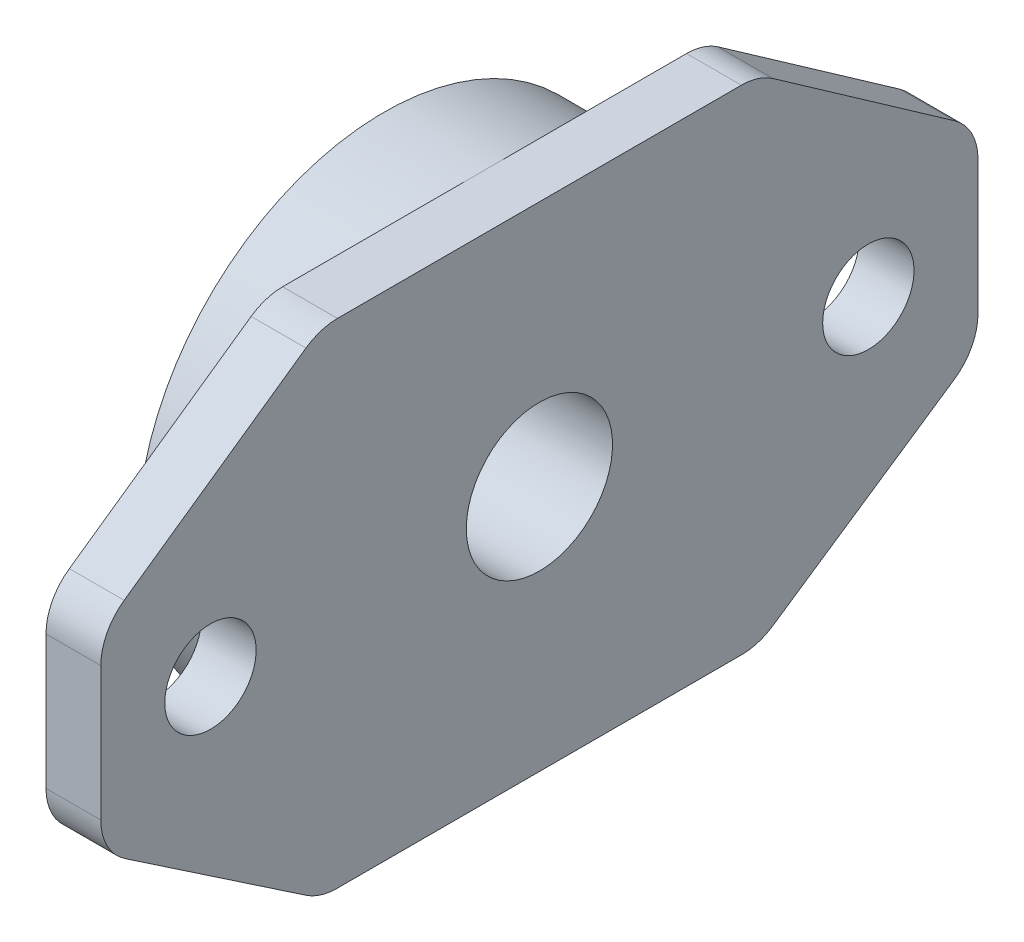
ISO-10303-21;
HEADER;
FILE_DESCRIPTION(('STEP AP214'),'2;1');
FILE_NAME('part.step','',(''),(''),'','','');
FILE_SCHEMA(('AUTOMOTIVE_DESIGN { 1 0 10303 214 1 1 1 1 }'));
ENDSEC;
DATA;
#1=APPLICATION_CONTEXT('core data for automotive mechanical design processes');
#2=APPLICATION_PROTOCOL_DEFINITION('international standard','automotive_design',2000,#1);
#3=PRODUCT_CONTEXT('',#1,'mechanical');
#4=PRODUCT('Part','Part','',(#3));
#5=PRODUCT_RELATED_PRODUCT_CATEGORY('part','',(#4));
#6=PRODUCT_DEFINITION_FORMATION('','',#4);
#7=PRODUCT_DEFINITION_CONTEXT('part definition',#1,'design');
#8=PRODUCT_DEFINITION('design','',#6,#7);
#9=PRODUCT_DEFINITION_SHAPE('','',#8);
#10=(LENGTH_UNIT() NAMED_UNIT(*) SI_UNIT(.MILLI.,.METRE.));
#11=(NAMED_UNIT(*) PLANE_ANGLE_UNIT() SI_UNIT($,.RADIAN.));
#12=(NAMED_UNIT(*) SI_UNIT($,.STERADIAN.) SOLID_ANGLE_UNIT());
#13=UNCERTAINTY_MEASURE_WITH_UNIT(LENGTH_MEASURE(1.E-05),#10,'distance_accuracy_value','');
#14=(GEOMETRIC_REPRESENTATION_CONTEXT(3) GLOBAL_UNCERTAINTY_ASSIGNED_CONTEXT((#13)) GLOBAL_UNIT_ASSIGNED_CONTEXT((#10,
#11,#12)) REPRESENTATION_CONTEXT('',''));
#15=CARTESIAN_POINT('',(0.,0.,0.));
#16=DIRECTION('',(0.,0.,1.));
#17=DIRECTION('',(1.,0.,0.));
#18=AXIS2_PLACEMENT_3D('',#15,#16,#17);
#19=CARTESIAN_POINT('',(0.,0.,0.));
#20=DIRECTION('',(-1.,0.,0.));
#21=DIRECTION('',(0.,0.,1.));
#22=AXIS2_PLACEMENT_3D('',#19,#20,#21);
#23=PLANE('',#22);
#24=DIRECTION('',(0.,0.559782835760467,-0.82863935266675));
#25=VECTOR('',#24,1.);
#26=CARTESIAN_POINT('',(0.,8.10653513800365,-48.));
#27=LINE('',#26,#25);
#28=CARTESIAN_POINT('',(0.,0.514081941999752,-36.7609889057381));
#29=VERTEX_POINT('',#28);
#30=CARTESIAN_POINT('',(0.,7.21437616043862,-46.6793485072814));
#31=VERTEX_POINT('',#30);
#32=EDGE_CURVE('E405',#29,#31,#27,.T.);
#33=ORIENTED_EDGE('',*,*,#32,.F.);
#34=CARTESIAN_POINT('',(0.,3.,-35.0816403984567));
#35=DIRECTION('',(-1.,0.,0.));
#36=DIRECTION('',(0.,0.,1.));
#37=AXIS2_PLACEMENT_3D('',#34,#35,#36);
#38=CIRCLE('',#37,3.);
#39=CARTESIAN_POINT('',(0.,0.,-35.0816403984567));
#40=VERTEX_POINT('',#39);
#41=EDGE_CURVE('E219',#29,#40,#38,.T.);
#42=ORIENTED_EDGE('',*,*,#41,.T.);
#43=DIRECTION('',(0.,0.,-1.));
#44=VECTOR('',#43,1.);
#45=CARTESIAN_POINT('',(0.,0.,0.));
#46=LINE('',#45,#44);
#47=CARTESIAN_POINT('',(0.,0.,-24.));
#48=VERTEX_POINT('',#47);
#49=EDGE_CURVE('E182',#48,#40,#46,.T.);
#50=ORIENTED_EDGE('',*,*,#49,.F.);
#51=CARTESIAN_POINT('',(0.,13.5,-24.));
#52=DIRECTION('',(-1.,0.,0.));
#53=DIRECTION('',(0.,0.,1.));
#54=AXIS2_PLACEMENT_3D('',#51,#52,#53);
#55=CIRCLE('',#54,13.5);
#56=CARTESIAN_POINT('',(0.,27.,-24.));
#57=VERTEX_POINT('',#56);
#58=EDGE_CURVE('E178',#57,#48,#55,.T.);
#59=ORIENTED_EDGE('',*,*,#58,.F.);
#60=DIRECTION('',(0.,0.,1.));
#61=VECTOR('',#60,1.);
#62=CARTESIAN_POINT('',(0.,27.,0.));
#63=LINE('',#62,#61);
#64=CARTESIAN_POINT('',(0.,27.,-35.0525635708657));
#65=VERTEX_POINT('',#64);
#66=EDGE_CURVE('E155',#65,#57,#63,.T.);
#67=ORIENTED_EDGE('',*,*,#66,.F.);
#68=CARTESIAN_POINT('',(0.,24.,-35.0525635708657));
#69=DIRECTION('',(-1.,0.,0.));
#70=DIRECTION('',(0.,0.,1.));
#71=AXIS2_PLACEMENT_3D('',#68,#69,#70);
#72=CIRCLE('',#71,3.);
#73=CARTESIAN_POINT('',(0.,26.455848362248,-36.7755867342746));
#74=VERTEX_POINT('',#73);
#75=EDGE_CURVE('E215',#65,#74,#72,.T.);
#76=ORIENTED_EDGE('',*,*,#75,.T.);
#77=DIRECTION('',(0.,0.574341054469645,0.818616120749339));
#78=VECTOR('',#77,1.);
#79=CARTESIAN_POINT('',(0.,27.,-36.));
#80=LINE('',#79,#78);
#81=CARTESIAN_POINT('',(0.,19.4767271561459,-46.7230231634089));
#82=VERTEX_POINT('',#81);
#83=EDGE_CURVE('E275',#82,#74,#80,.T.);
#84=ORIENTED_EDGE('',*,*,#83,.F.);
#85=CARTESIAN_POINT('',(0.,17.0208787938979,-45.));
#86=DIRECTION('',(-1.,0.,0.));
#87=DIRECTION('',(0.,0.,1.));
#88=AXIS2_PLACEMENT_3D('',#85,#86,#87);
#89=CIRCLE('',#88,3.);
#90=CARTESIAN_POINT('',(0.,17.0208787938979,-48.));
#91=VERTEX_POINT('',#90);
#92=EDGE_CURVE('E213',#82,#91,#89,.T.);
#93=ORIENTED_EDGE('',*,*,#92,.T.);
#94=DIRECTION('',(0.,1.,0.));
#95=VECTOR('',#94,1.);
#96=CARTESIAN_POINT('',(0.,0.,-48.));
#97=LINE('',#96,#95);
#98=CARTESIAN_POINT('',(0.,9.70029421843887,-48.));
#99=VERTEX_POINT('',#98);
#100=EDGE_CURVE('E176',#99,#91,#97,.T.);
#101=ORIENTED_EDGE('',*,*,#100,.F.);
#102=CARTESIAN_POINT('',(0.,9.70029421843887,-45.));
#103=DIRECTION('',(-1.,0.,0.));
#104=DIRECTION('',(0.,0.,1.));
#105=AXIS2_PLACEMENT_3D('',#102,#103,#104);
#106=CIRCLE('',#105,3.);
#107=EDGE_CURVE('E217',#99,#31,#106,.T.);
#108=ORIENTED_EDGE('',*,*,#107,.T.);
#109=EDGE_LOOP('',(#33,#42,#50,#59,#67,#76,#84,#93,#101,#108));
#110=FACE_BOUND('',#109,.T.);
#111=CARTESIAN_POINT('',(0.,13.5,-42.));
#112=DIRECTION('',(-1.,0.,0.));
#113=DIRECTION('',(0.,0.,1.));
#114=AXIS2_PLACEMENT_3D('',#111,#112,#113);
#115=CIRCLE('',#114,2.5);
#116=CARTESIAN_POINT('',(0.,13.5,-39.5));
#117=VERTEX_POINT('',#116);
#118=EDGE_CURVE('E294',#117,#117,#115,.T.);
#119=ORIENTED_EDGE('',*,*,#118,.F.);
#120=EDGE_LOOP('',(#119));
#121=FACE_BOUND('',#120,.T.);
#122=ADVANCED_FACE('F34',(#110,#121),#23,.T.);
#123=CARTESIAN_POINT('',(3.,0.,0.));
#124=DIRECTION('',(0.,0.,-1.));
#125=DIRECTION('',(-1.,0.,0.));
#126=AXIS2_PLACEMENT_3D('',#123,#124,#125);
#127=PLANE('',#126);
#128=DIRECTION('',(0.,-1.,0.));
#129=VECTOR('',#128,1.);
#130=CARTESIAN_POINT('',(0.,0.,0.));
#131=LINE('',#130,#129);
#132=CARTESIAN_POINT('',(0.,17.0208787938979,0.));
#133=VERTEX_POINT('',#132);
#134=CARTESIAN_POINT('',(0.,9.70029421843887,0.));
#135=VERTEX_POINT('',#134);
#136=EDGE_CURVE('E205',#133,#135,#131,.T.);
#137=ORIENTED_EDGE('',*,*,#136,.T.);
#138=DIRECTION('',(-1.,0.,0.));
#139=VECTOR('',#138,1.);
#140=CARTESIAN_POINT('',(3.,9.70029421843887,0.));
#141=LINE('',#140,#139);
#142=CARTESIAN_POINT('',(3.,9.70029421843887,0.));
#143=VERTEX_POINT('',#142);
#144=EDGE_CURVE('E254',#135,#143,#141,.F.);
#145=ORIENTED_EDGE('',*,*,#144,.T.);
#146=DIRECTION('',(0.,-1.,0.));
#147=VECTOR('',#146,1.);
#148=CARTESIAN_POINT('',(3.,0.,0.));
#149=LINE('',#148,#147);
#150=CARTESIAN_POINT('',(3.,17.0208787938979,0.));
#151=VERTEX_POINT('',#150);
#152=EDGE_CURVE('E165',#151,#143,#149,.T.);
#153=ORIENTED_EDGE('',*,*,#152,.F.);
#154=DIRECTION('',(-1.,0.,0.));
#155=VECTOR('',#154,1.);
#156=CARTESIAN_POINT('',(3.,17.0208787938979,0.));
#157=LINE('',#156,#155);
#158=EDGE_CURVE('E252',#151,#133,#157,.T.);
#159=ORIENTED_EDGE('',*,*,#158,.T.);
#160=EDGE_LOOP('',(#137,#145,#153,#159));
#161=FACE_BOUND('',#160,.T.);
#162=ADVANCED_FACE('F331',(#161),#127,.F.);
#163=CARTESIAN_POINT('',(3.,0.,0.));
#164=DIRECTION('',(0.,1.,0.));
#165=DIRECTION('',(0.,0.,1.));
#166=AXIS2_PLACEMENT_3D('',#163,#164,#165);
#167=PLANE('',#166);
#168=ORIENTED_EDGE('',*,*,#49,.T.);
#169=DIRECTION('',(-1.,0.,0.));
#170=VECTOR('',#169,1.);
#171=CARTESIAN_POINT('',(3.,0.,-35.0816403984567));
#172=LINE('',#171,#170);
#173=CARTESIAN_POINT('',(3.,0.,-35.0816403984567));
#174=VERTEX_POINT('',#173);
#175=EDGE_CURVE('E224',#40,#174,#172,.F.);
#176=ORIENTED_EDGE('',*,*,#175,.T.);
#177=DIRECTION('',(0.,0.,-1.));
#178=VECTOR('',#177,1.);
#179=CARTESIAN_POINT('',(3.,0.,0.));
#180=LINE('',#179,#178);
#181=CARTESIAN_POINT('',(3.,0.,-12.9183596015433));
#182=VERTEX_POINT('',#181);
#183=EDGE_CURVE('E200',#182,#174,#180,.T.);
#184=ORIENTED_EDGE('',*,*,#183,.F.);
#185=DIRECTION('',(-1.,0.,0.));
#186=VECTOR('',#185,1.);
#187=CARTESIAN_POINT('',(3.,0.,-12.9183596015433));
#188=LINE('',#187,#186);
#189=CARTESIAN_POINT('',(0.,0.,-12.9183596015433));
#190=VERTEX_POINT('',#189);
#191=EDGE_CURVE('E221',#182,#190,#188,.T.);
#192=ORIENTED_EDGE('',*,*,#191,.T.);
#193=EDGE_CURVE('E207',#190,#48,#46,.T.);
#194=ORIENTED_EDGE('',*,*,#193,.T.);
#195=EDGE_LOOP('',(#168,#176,#184,#192,#194));
#196=FACE_BOUND('',#195,.T.);
#197=ADVANCED_FACE('F335',(#196),#167,.F.);
#198=CARTESIAN_POINT('',(3.,0.,-48.));
#199=DIRECTION('',(0.,0.,1.));
#200=DIRECTION('',(1.,0.,0.));
#201=AXIS2_PLACEMENT_3D('',#198,#199,#200);
#202=PLANE('',#201);
#203=DIRECTION('',(0.,1.,0.));
#204=VECTOR('',#203,1.);
#205=CARTESIAN_POINT('',(3.,0.,-48.));
#206=LINE('',#205,#204);
#207=CARTESIAN_POINT('',(3.,9.70029421843887,-48.));
#208=VERTEX_POINT('',#207);
#209=CARTESIAN_POINT('',(3.,17.0208787938979,-48.));
#210=VERTEX_POINT('',#209);
#211=EDGE_CURVE('E193',#208,#210,#206,.T.);
#212=ORIENTED_EDGE('',*,*,#211,.F.);
#213=DIRECTION('',(-1.,0.,0.));
#214=VECTOR('',#213,1.);
#215=CARTESIAN_POINT('',(3.,9.70029421843887,-48.));
#216=LINE('',#215,#214);
#217=EDGE_CURVE('E266',#208,#99,#216,.T.);
#218=ORIENTED_EDGE('',*,*,#217,.T.);
#219=ORIENTED_EDGE('',*,*,#100,.T.);
#220=DIRECTION('',(-1.,0.,0.));
#221=VECTOR('',#220,1.);
#222=CARTESIAN_POINT('',(3.,17.0208787938979,-48.));
#223=LINE('',#222,#221);
#224=EDGE_CURVE('E264',#91,#210,#223,.F.);
#225=ORIENTED_EDGE('',*,*,#224,.T.);
#226=EDGE_LOOP('',(#212,#218,#219,#225));
#227=FACE_BOUND('',#226,.T.);
#228=ADVANCED_FACE('F341',(#227),#202,.F.);
#229=CARTESIAN_POINT('',(3.,27.,0.));
#230=DIRECTION('',(0.,-1.,0.));
#231=DIRECTION('',(0.,0.,-1.));
#232=AXIS2_PLACEMENT_3D('',#229,#230,#231);
#233=PLANE('',#232);
#234=CARTESIAN_POINT('',(0.,27.,-12.9474364291344));
#235=VERTEX_POINT('',#234);
#236=EDGE_CURVE('E158',#57,#235,#63,.T.);
#237=ORIENTED_EDGE('',*,*,#236,.T.);
#238=DIRECTION('',(-1.,0.,0.));
#239=VECTOR('',#238,1.);
#240=CARTESIAN_POINT('',(3.,27.,-12.9474364291344));
#241=LINE('',#240,#239);
#242=CARTESIAN_POINT('',(3.,27.,-12.9474364291344));
#243=VERTEX_POINT('',#242);
#244=EDGE_CURVE('E262',#235,#243,#241,.F.);
#245=ORIENTED_EDGE('',*,*,#244,.T.);
#246=DIRECTION('',(0.,0.,1.));
#247=VECTOR('',#246,1.);
#248=CARTESIAN_POINT('',(3.,27.,0.));
#249=LINE('',#248,#247);
#250=CARTESIAN_POINT('',(3.,27.,-35.0525635708657));
#251=VERTEX_POINT('',#250);
#252=EDGE_CURVE('E189',#251,#243,#249,.T.);
#253=ORIENTED_EDGE('',*,*,#252,.F.);
#254=DIRECTION('',(-1.,0.,0.));
#255=VECTOR('',#254,1.);
#256=CARTESIAN_POINT('',(3.,27.,-35.0525635708657));
#257=LINE('',#256,#255);
#258=EDGE_CURVE('E162',#251,#65,#257,.T.);
#259=ORIENTED_EDGE('',*,*,#258,.T.);
#260=ORIENTED_EDGE('',*,*,#66,.T.);
#261=EDGE_LOOP('',(#237,#245,#253,#259,#260));
#262=FACE_BOUND('',#261,.T.);
#263=ADVANCED_FACE('F157',(#262),#233,.F.);
#264=CARTESIAN_POINT('',(3.,0.,0.));
#265=DIRECTION('',(-1.,0.,0.));
#266=DIRECTION('',(0.,0.,1.));
#267=AXIS2_PLACEMENT_3D('',#264,#265,#266);
#268=PLANE('',#267);
#269=CARTESIAN_POINT('',(3.,13.5,-6.));
#270=DIRECTION('',(-1.,0.,0.));
#271=DIRECTION('',(0.,0.,1.));
#272=AXIS2_PLACEMENT_3D('',#269,#270,#271);
#273=CIRCLE('',#272,2.5);
#274=CARTESIAN_POINT('',(3.,13.5,-3.5));
#275=VERTEX_POINT('',#274);
#276=EDGE_CURVE('E291',#275,#275,#273,.T.);
#277=ORIENTED_EDGE('',*,*,#276,.T.);
#278=EDGE_LOOP('',(#277));
#279=FACE_BOUND('',#278,.T.);
#280=CARTESIAN_POINT('',(3.,13.5,-42.));
#281=DIRECTION('',(-1.,0.,0.));
#282=DIRECTION('',(0.,0.,1.));
#283=AXIS2_PLACEMENT_3D('',#280,#281,#282);
#284=CIRCLE('',#283,2.5);
#285=CARTESIAN_POINT('',(3.,13.5,-39.5));
#286=VERTEX_POINT('',#285);
#287=EDGE_CURVE('E297',#286,#286,#284,.T.);
#288=ORIENTED_EDGE('',*,*,#287,.T.);
#289=EDGE_LOOP('',(#288));
#290=FACE_BOUND('',#289,.T.);
#291=CARTESIAN_POINT('',(3.,13.5,-24.));
#292=DIRECTION('',(-1.,0.,0.));
#293=DIRECTION('',(0.,0.,1.));
#294=AXIS2_PLACEMENT_3D('',#291,#292,#293);
#295=CIRCLE('',#294,4.);
#296=CARTESIAN_POINT('',(3.,13.5,-20.));
#297=VERTEX_POINT('',#296);
#298=EDGE_CURVE('E303',#297,#297,#295,.T.);
#299=ORIENTED_EDGE('',*,*,#298,.T.);
#300=EDGE_LOOP('',(#299));
#301=FACE_BOUND('',#300,.T.);
#302=ORIENTED_EDGE('',*,*,#183,.T.);
#303=CARTESIAN_POINT('',(3.,3.,-35.0816403984567));
#304=DIRECTION('',(-1.,0.,0.));
#305=DIRECTION('',(0.,0.,1.));
#306=AXIS2_PLACEMENT_3D('',#303,#304,#305);
#307=CIRCLE('',#306,3.);
#308=CARTESIAN_POINT('',(3.,0.514081941999752,-36.7609889057381));
#309=VERTEX_POINT('',#308);
#310=EDGE_CURVE('E240',#174,#309,#307,.F.);
#311=ORIENTED_EDGE('',*,*,#310,.T.);
#312=DIRECTION('',(0.,0.559782835760467,-0.82863935266675));
#313=VECTOR('',#312,1.);
#314=CARTESIAN_POINT('',(3.,8.10653513800365,-48.));
#315=LINE('',#314,#313);
#316=CARTESIAN_POINT('',(3.,7.21437616043862,-46.6793485072814));
#317=VERTEX_POINT('',#316);
#318=EDGE_CURVE('E401',#309,#317,#315,.T.);
#319=ORIENTED_EDGE('',*,*,#318,.T.);
#320=CARTESIAN_POINT('',(3.,9.70029421843887,-45.));
#321=DIRECTION('',(-1.,0.,0.));
#322=DIRECTION('',(0.,0.,1.));
#323=AXIS2_PLACEMENT_3D('',#320,#321,#322);
#324=CIRCLE('',#323,3.);
#325=EDGE_CURVE('E230',#317,#208,#324,.F.);
#326=ORIENTED_EDGE('',*,*,#325,.T.);
#327=ORIENTED_EDGE('',*,*,#211,.T.);
#328=CARTESIAN_POINT('',(3.,17.0208787938979,-45.));
#329=DIRECTION('',(-1.,0.,0.));
#330=DIRECTION('',(0.,0.,1.));
#331=AXIS2_PLACEMENT_3D('',#328,#329,#330);
#332=CIRCLE('',#331,3.);
#333=CARTESIAN_POINT('',(3.,19.4767271561459,-46.7230231634089));
#334=VERTEX_POINT('',#333);
#335=EDGE_CURVE('E226',#210,#334,#332,.F.);
#336=ORIENTED_EDGE('',*,*,#335,.T.);
#337=DIRECTION('',(0.,0.574341054469645,0.818616120749339));
#338=VECTOR('',#337,1.);
#339=CARTESIAN_POINT('',(3.,27.,-36.));
#340=LINE('',#339,#338);
#341=CARTESIAN_POINT('',(3.,26.455848362248,-36.7755867342746));
#342=VERTEX_POINT('',#341);
#343=EDGE_CURVE('E278',#334,#342,#340,.T.);
#344=ORIENTED_EDGE('',*,*,#343,.T.);
#345=CARTESIAN_POINT('',(3.,24.,-35.0525635708657));
#346=DIRECTION('',(-1.,0.,0.));
#347=DIRECTION('',(0.,0.,1.));
#348=AXIS2_PLACEMENT_3D('',#345,#346,#347);
#349=CIRCLE('',#348,3.);
#350=EDGE_CURVE('E228',#342,#251,#349,.F.);
#351=ORIENTED_EDGE('',*,*,#350,.T.);
#352=ORIENTED_EDGE('',*,*,#252,.T.);
#353=CARTESIAN_POINT('',(3.,24.,-12.9474364291344));
#354=DIRECTION('',(-1.,0.,0.));
#355=DIRECTION('',(0.,0.,1.));
#356=AXIS2_PLACEMENT_3D('',#353,#354,#355);
#357=CIRCLE('',#356,3.);
#358=CARTESIAN_POINT('',(3.,26.455848362248,-11.2244132657254));
#359=VERTEX_POINT('',#358);
#360=EDGE_CURVE('E232',#243,#359,#357,.F.);
#361=ORIENTED_EDGE('',*,*,#360,.T.);
#362=DIRECTION('',(0.,-0.574341054469645,0.818616120749339));
#363=VECTOR('',#362,1.);
#364=CARTESIAN_POINT('',(3.,27.,-12.));
#365=LINE('',#364,#363);
#366=CARTESIAN_POINT('',(3.,19.4767271561459,-1.27697683659107));
#367=VERTEX_POINT('',#366);
#368=EDGE_CURVE('E282',#359,#367,#365,.T.);
#369=ORIENTED_EDGE('',*,*,#368,.T.);
#370=CARTESIAN_POINT('',(3.,17.0208787938979,-3.));
#371=DIRECTION('',(-1.,0.,0.));
#372=DIRECTION('',(0.,0.,1.));
#373=AXIS2_PLACEMENT_3D('',#370,#371,#372);
#374=CIRCLE('',#373,3.);
#375=EDGE_CURVE('E234',#367,#151,#374,.F.);
#376=ORIENTED_EDGE('',*,*,#375,.T.);
#377=ORIENTED_EDGE('',*,*,#152,.T.);
#378=CARTESIAN_POINT('',(3.,9.70029421843887,-3.));
#379=DIRECTION('',(-1.,0.,0.));
#380=DIRECTION('',(0.,0.,1.));
#381=AXIS2_PLACEMENT_3D('',#378,#379,#380);
#382=CIRCLE('',#381,3.);
#383=CARTESIAN_POINT('',(3.,7.21437616043862,-1.3206514927186));
#384=VERTEX_POINT('',#383);
#385=EDGE_CURVE('E236',#143,#384,#382,.F.);
#386=ORIENTED_EDGE('',*,*,#385,.T.);
#387=DIRECTION('',(0.,-0.559782835760467,-0.82863935266675));
#388=VECTOR('',#387,1.);
#389=CARTESIAN_POINT('',(3.,0.,-12.));
#390=LINE('',#389,#388);
#391=CARTESIAN_POINT('',(3.,0.514081941999752,-11.2390110942619));
#392=VERTEX_POINT('',#391);
#393=EDGE_CURVE('E392',#384,#392,#390,.T.);
#394=ORIENTED_EDGE('',*,*,#393,.T.);
#395=CARTESIAN_POINT('',(3.,3.,-12.9183596015433));
#396=DIRECTION('',(-1.,0.,0.));
#397=DIRECTION('',(0.,0.,1.));
#398=AXIS2_PLACEMENT_3D('',#395,#396,#397);
#399=CIRCLE('',#398,3.);
#400=EDGE_CURVE('E238',#392,#182,#399,.F.);
#401=ORIENTED_EDGE('',*,*,#400,.T.);
#402=EDGE_LOOP('',(#302,#311,#319,#326,#327,#336,#344,#351,#352,#361,#369,#376,#377,#386,#394,#401));
#403=FACE_BOUND('',#402,.T.);
#404=ADVANCED_FACE('F327',(#279,#290,#301,#403),#268,.F.);
#405=ORIENTED_EDGE('',*,*,#193,.F.);
#406=CARTESIAN_POINT('',(0.,3.,-12.9183596015433));
#407=DIRECTION('',(-1.,0.,0.));
#408=DIRECTION('',(0.,0.,1.));
#409=AXIS2_PLACEMENT_3D('',#406,#407,#408);
#410=CIRCLE('',#409,3.);
#411=CARTESIAN_POINT('',(0.,0.514081941999752,-11.2390110942619));
#412=VERTEX_POINT('',#411);
#413=EDGE_CURVE('E245',#190,#412,#410,.T.);
#414=ORIENTED_EDGE('',*,*,#413,.T.);
#415=DIRECTION('',(0.,-0.559782835760467,-0.82863935266675));
#416=VECTOR('',#415,1.);
#417=CARTESIAN_POINT('',(0.,0.,-12.));
#418=LINE('',#417,#416);
#419=CARTESIAN_POINT('',(0.,7.21437616043862,-1.3206514927186));
#420=VERTEX_POINT('',#419);
#421=EDGE_CURVE('E398',#420,#412,#418,.T.);
#422=ORIENTED_EDGE('',*,*,#421,.F.);
#423=CARTESIAN_POINT('',(0.,9.70029421843887,-3.));
#424=DIRECTION('',(-1.,0.,0.));
#425=DIRECTION('',(0.,0.,1.));
#426=AXIS2_PLACEMENT_3D('',#423,#424,#425);
#427=CIRCLE('',#426,3.);
#428=EDGE_CURVE('E49',#420,#135,#427,.T.);
#429=ORIENTED_EDGE('',*,*,#428,.T.);
#430=ORIENTED_EDGE('',*,*,#136,.F.);
#431=CARTESIAN_POINT('',(0.,17.0208787938979,-3.));
#432=DIRECTION('',(-1.,0.,0.));
#433=DIRECTION('',(0.,0.,1.));
#434=AXIS2_PLACEMENT_3D('',#431,#432,#433);
#435=CIRCLE('',#434,3.);
#436=CARTESIAN_POINT('',(0.,19.4767271561459,-1.27697683659107));
#437=VERTEX_POINT('',#436);
#438=EDGE_CURVE('E57',#133,#437,#435,.T.);
#439=ORIENTED_EDGE('',*,*,#438,.T.);
#440=DIRECTION('',(0.,-0.574341054469645,0.818616120749339));
#441=VECTOR('',#440,1.);
#442=CARTESIAN_POINT('',(0.,27.,-12.));
#443=LINE('',#442,#441);
#444=CARTESIAN_POINT('',(0.,26.455848362248,-11.2244132657254));
#445=VERTEX_POINT('',#444);
#446=EDGE_CURVE('E287',#445,#437,#443,.T.);
#447=ORIENTED_EDGE('',*,*,#446,.F.);
#448=CARTESIAN_POINT('',(0.,24.,-12.9474364291344));
#449=DIRECTION('',(-1.,0.,0.));
#450=DIRECTION('',(0.,0.,1.));
#451=AXIS2_PLACEMENT_3D('',#448,#449,#450);
#452=CIRCLE('',#451,3.);
#453=EDGE_CURVE('E175',#445,#235,#452,.T.);
#454=ORIENTED_EDGE('',*,*,#453,.T.);
#455=ORIENTED_EDGE('',*,*,#236,.F.);
#456=EDGE_CURVE('E172',#48,#57,#55,.T.);
#457=ORIENTED_EDGE('',*,*,#456,.F.);
#458=EDGE_LOOP('',(#405,#414,#422,#429,#430,#439,#447,#454,#455,#457));
#459=FACE_BOUND('',#458,.T.);
#460=CARTESIAN_POINT('',(0.,13.5,-6.));
#461=DIRECTION('',(-1.,0.,0.));
#462=DIRECTION('',(0.,0.,1.));
#463=AXIS2_PLACEMENT_3D('',#460,#461,#462);
#464=CIRCLE('',#463,2.5);
#465=CARTESIAN_POINT('',(0.,13.5,-3.5));
#466=VERTEX_POINT('',#465);
#467=EDGE_CURVE('E284',#466,#466,#464,.T.);
#468=ORIENTED_EDGE('',*,*,#467,.F.);
#469=EDGE_LOOP('',(#468));
#470=FACE_BOUND('',#469,.T.);
#471=ADVANCED_FACE('F169',(#459,#470),#23,.T.);
#472=CARTESIAN_POINT('',(-5.5,13.5,-24.));
#473=DIRECTION('',(1.,0.,0.));
#474=DIRECTION('',(0.,0.,-1.));
#475=AXIS2_PLACEMENT_3D('',#472,#473,#474);
#476=CYLINDRICAL_SURFACE('',#475,13.5);
#477=CARTESIAN_POINT('',(-5.5,13.5,-24.));
#478=DIRECTION('',(-1.,0.,0.));
#479=DIRECTION('',(0.,0.,1.));
#480=AXIS2_PLACEMENT_3D('',#477,#478,#479);
#481=CIRCLE('',#480,13.5);
#482=CARTESIAN_POINT('',(-5.5,13.5,-10.5));
#483=VERTEX_POINT('',#482);
#484=EDGE_CURVE('E184',#483,#483,#481,.T.);
#485=ORIENTED_EDGE('',*,*,#484,.F.);
#486=EDGE_LOOP('',(#485));
#487=FACE_BOUND('',#486,.T.);
#488=ORIENTED_EDGE('',*,*,#58,.T.);
#489=ORIENTED_EDGE('',*,*,#456,.T.);
#490=EDGE_LOOP('',(#488,#489));
#491=FACE_BOUND('',#490,.T.);
#492=ADVANCED_FACE('F187',(#487,#491),#476,.T.);
#493=CARTESIAN_POINT('',(-5.5,13.5,-24.));
#494=DIRECTION('',(-1.,0.,0.));
#495=DIRECTION('',(0.,0.,1.));
#496=AXIS2_PLACEMENT_3D('',#493,#494,#495);
#497=PLANE('',#496);
#498=CARTESIAN_POINT('',(-5.5,13.5,-24.));
#499=DIRECTION('',(-1.,0.,0.));
#500=DIRECTION('',(0.,0.,1.));
#501=AXIS2_PLACEMENT_3D('',#498,#499,#500);
#502=CIRCLE('',#501,5.);
#503=CARTESIAN_POINT('',(-5.5,13.5,-19.));
#504=VERTEX_POINT('',#503);
#505=EDGE_CURVE('E306',#504,#504,#502,.T.);
#506=ORIENTED_EDGE('',*,*,#505,.F.);
#507=EDGE_LOOP('',(#506));
#508=FACE_BOUND('',#507,.T.);
#509=ORIENTED_EDGE('',*,*,#484,.T.);
#510=EDGE_LOOP('',(#509));
#511=FACE_BOUND('',#510,.T.);
#512=ADVANCED_FACE('F315',(#508,#511),#497,.T.);
#513=CARTESIAN_POINT('',(-10.,13.5,-24.));
#514=DIRECTION('',(1.,0.,0.));
#515=DIRECTION('',(0.,0.,-1.));
#516=AXIS2_PLACEMENT_3D('',#513,#514,#515);
#517=CYLINDRICAL_SURFACE('',#516,5.);
#518=CARTESIAN_POINT('',(-10.,13.5,-24.));
#519=DIRECTION('',(-1.,0.,0.));
#520=DIRECTION('',(0.,0.,1.));
#521=AXIS2_PLACEMENT_3D('',#518,#519,#520);
#522=CIRCLE('',#521,5.);
#523=CARTESIAN_POINT('',(-10.,13.5,-19.));
#524=VERTEX_POINT('',#523);
#525=EDGE_CURVE('E185',#524,#524,#522,.T.);
#526=ORIENTED_EDGE('',*,*,#525,.F.);
#527=EDGE_LOOP('',(#526));
#528=FACE_BOUND('',#527,.T.);
#529=ORIENTED_EDGE('',*,*,#505,.T.);
#530=EDGE_LOOP('',(#529));
#531=FACE_BOUND('',#530,.T.);
#532=ADVANCED_FACE('F313',(#528,#531),#517,.T.);
#533=CARTESIAN_POINT('',(-10.,13.5,-24.));
#534=DIRECTION('',(-1.,0.,0.));
#535=DIRECTION('',(0.,0.,1.));
#536=AXIS2_PLACEMENT_3D('',#533,#534,#535);
#537=PLANE('',#536);
#538=CARTESIAN_POINT('',(-10.,13.5,-24.));
#539=DIRECTION('',(-1.,0.,0.));
#540=DIRECTION('',(0.,0.,1.));
#541=AXIS2_PLACEMENT_3D('',#538,#539,#540);
#542=CIRCLE('',#541,4.);
#543=CARTESIAN_POINT('',(-10.,13.5,-20.));
#544=VERTEX_POINT('',#543);
#545=EDGE_CURVE('E300',#544,#544,#542,.T.);
#546=ORIENTED_EDGE('',*,*,#545,.F.);
#547=EDGE_LOOP('',(#546));
#548=FACE_BOUND('',#547,.T.);
#549=ORIENTED_EDGE('',*,*,#525,.T.);
#550=EDGE_LOOP('',(#549));
#551=FACE_BOUND('',#550,.T.);
#552=ADVANCED_FACE('F440',(#548,#551),#537,.T.);
#553=CARTESIAN_POINT('',(3.,13.5,-24.));
#554=DIRECTION('',(-1.,0.,0.));
#555=DIRECTION('',(0.,0.,1.));
#556=AXIS2_PLACEMENT_3D('',#553,#554,#555);
#557=CYLINDRICAL_SURFACE('',#556,4.);
#558=ORIENTED_EDGE('',*,*,#298,.F.);
#559=EDGE_LOOP('',(#558));
#560=FACE_BOUND('',#559,.T.);
#561=ORIENTED_EDGE('',*,*,#545,.T.);
#562=EDGE_LOOP('',(#561));
#563=FACE_BOUND('',#562,.T.);
#564=ADVANCED_FACE('F436',(#560,#563),#557,.F.);
#565=CARTESIAN_POINT('',(3.,13.5,-42.));
#566=DIRECTION('',(-1.,0.,0.));
#567=DIRECTION('',(0.,0.,1.));
#568=AXIS2_PLACEMENT_3D('',#565,#566,#567);
#569=CYLINDRICAL_SURFACE('',#568,2.5);
#570=ORIENTED_EDGE('',*,*,#287,.F.);
#571=EDGE_LOOP('',(#570));
#572=FACE_BOUND('',#571,.T.);
#573=ORIENTED_EDGE('',*,*,#118,.T.);
#574=EDGE_LOOP('',(#573));
#575=FACE_BOUND('',#574,.T.);
#576=ADVANCED_FACE('F432',(#572,#575),#569,.F.);
#577=CARTESIAN_POINT('',(3.,13.5,-6.));
#578=DIRECTION('',(-1.,0.,0.));
#579=DIRECTION('',(0.,0.,1.));
#580=AXIS2_PLACEMENT_3D('',#577,#578,#579);
#581=CYLINDRICAL_SURFACE('',#580,2.5);
#582=ORIENTED_EDGE('',*,*,#276,.F.);
#583=EDGE_LOOP('',(#582));
#584=FACE_BOUND('',#583,.T.);
#585=ORIENTED_EDGE('',*,*,#467,.T.);
#586=EDGE_LOOP('',(#585));
#587=FACE_BOUND('',#586,.T.);
#588=ADVANCED_FACE('F429',(#584,#587),#581,.F.);
#589=CARTESIAN_POINT('',(3.,27.,-36.));
#590=DIRECTION('',(0.,-0.818616120749339,0.574341054469645));
#591=DIRECTION('',(0.,-0.574341054469645,-0.818616120749339));
#592=AXIS2_PLACEMENT_3D('',#589,#590,#591);
#593=PLANE('',#592);
#594=ORIENTED_EDGE('',*,*,#83,.T.);
#595=DIRECTION('',(-1.,0.,0.));
#596=VECTOR('',#595,1.);
#597=CARTESIAN_POINT('',(3.,26.455848362248,-36.7755867342746));
#598=LINE('',#597,#596);
#599=EDGE_CURVE('E11',#74,#342,#598,.F.);
#600=ORIENTED_EDGE('',*,*,#599,.T.);
#601=ORIENTED_EDGE('',*,*,#343,.F.);
#602=DIRECTION('',(-1.,0.,0.));
#603=VECTOR('',#602,1.);
#604=CARTESIAN_POINT('',(3.,19.4767271561459,-46.7230231634089));
#605=LINE('',#604,#603);
#606=EDGE_CURVE('E42',#334,#82,#605,.T.);
#607=ORIENTED_EDGE('',*,*,#606,.T.);
#608=EDGE_LOOP('',(#594,#600,#601,#607));
#609=FACE_BOUND('',#608,.T.);
#610=ADVANCED_FACE('F274',(#609),#593,.F.);
#611=CARTESIAN_POINT('',(3.,0.,-12.));
#612=DIRECTION('',(0.,0.82863935266675,-0.559782835760467));
#613=DIRECTION('',(0.,0.559782835760467,0.82863935266675));
#614=AXIS2_PLACEMENT_3D('',#611,#612,#613);
#615=PLANE('',#614);
#616=ORIENTED_EDGE('',*,*,#421,.T.);
#617=DIRECTION('',(-1.,0.,0.));
#618=VECTOR('',#617,1.);
#619=CARTESIAN_POINT('',(3.,0.514081941999752,-11.2390110942619));
#620=LINE('',#619,#618);
#621=EDGE_CURVE('E250',#412,#392,#620,.F.);
#622=ORIENTED_EDGE('',*,*,#621,.T.);
#623=ORIENTED_EDGE('',*,*,#393,.F.);
#624=DIRECTION('',(-1.,0.,0.));
#625=VECTOR('',#624,1.);
#626=CARTESIAN_POINT('',(3.,7.21437616043862,-1.3206514927186));
#627=LINE('',#626,#625);
#628=EDGE_CURVE('E247',#384,#420,#627,.T.);
#629=ORIENTED_EDGE('',*,*,#628,.T.);
#630=EDGE_LOOP('',(#616,#622,#623,#629));
#631=FACE_BOUND('',#630,.T.);
#632=ADVANCED_FACE('F396',(#631),#615,.F.);
#633=CARTESIAN_POINT('',(3.,27.,-12.));
#634=DIRECTION('',(0.,-0.818616120749339,-0.574341054469645));
#635=DIRECTION('',(0.,0.574341054469645,-0.818616120749339));
#636=AXIS2_PLACEMENT_3D('',#633,#634,#635);
#637=PLANE('',#636);
#638=ORIENTED_EDGE('',*,*,#446,.T.);
#639=DIRECTION('',(-1.,0.,0.));
#640=VECTOR('',#639,1.);
#641=CARTESIAN_POINT('',(3.,19.4767271561459,-1.27697683659106));
#642=LINE('',#641,#640);
#643=EDGE_CURVE('E259',#437,#367,#642,.F.);
#644=ORIENTED_EDGE('',*,*,#643,.T.);
#645=ORIENTED_EDGE('',*,*,#368,.F.);
#646=DIRECTION('',(-1.,0.,0.));
#647=VECTOR('',#646,1.);
#648=CARTESIAN_POINT('',(3.,26.455848362248,-11.2244132657254));
#649=LINE('',#648,#647);
#650=EDGE_CURVE('E256',#359,#445,#649,.T.);
#651=ORIENTED_EDGE('',*,*,#650,.T.);
#652=EDGE_LOOP('',(#638,#644,#645,#651));
#653=FACE_BOUND('',#652,.T.);
#654=ADVANCED_FACE('F385',(#653),#637,.F.);
#655=CARTESIAN_POINT('',(3.,8.10653513800365,-48.));
#656=DIRECTION('',(0.,0.82863935266675,0.559782835760467));
#657=DIRECTION('',(0.,-0.559782835760467,0.82863935266675));
#658=AXIS2_PLACEMENT_3D('',#655,#656,#657);
#659=PLANE('',#658);
#660=ORIENTED_EDGE('',*,*,#318,.F.);
#661=DIRECTION('',(-1.,0.,0.));
#662=VECTOR('',#661,1.);
#663=CARTESIAN_POINT('',(3.,0.514081941999752,-36.7609889057381));
#664=LINE('',#663,#662);
#665=EDGE_CURVE('E190',#309,#29,#664,.T.);
#666=ORIENTED_EDGE('',*,*,#665,.T.);
#667=ORIENTED_EDGE('',*,*,#32,.T.);
#668=DIRECTION('',(-1.,0.,0.));
#669=VECTOR('',#668,1.);
#670=CARTESIAN_POINT('',(3.,7.21437616043862,-46.6793485072814));
#671=LINE('',#670,#669);
#672=EDGE_CURVE('E188',#31,#317,#671,.F.);
#673=ORIENTED_EDGE('',*,*,#672,.T.);
#674=EDGE_LOOP('',(#660,#666,#667,#673));
#675=FACE_BOUND('',#674,.T.);
#676=ADVANCED_FACE('F352',(#675),#659,.F.);
#677=CARTESIAN_POINT('',(3.,3.,-35.0816403984567));
#678=DIRECTION('',(-1.,0.,0.));
#679=DIRECTION('',(0.,0.,1.));
#680=AXIS2_PLACEMENT_3D('',#677,#678,#679);
#681=CYLINDRICAL_SURFACE('',#680,3.);
#682=ORIENTED_EDGE('',*,*,#310,.F.);
#683=ORIENTED_EDGE('',*,*,#175,.F.);
#684=ORIENTED_EDGE('',*,*,#41,.F.);
#685=ORIENTED_EDGE('',*,*,#665,.F.);
#686=EDGE_LOOP('',(#682,#683,#684,#685));
#687=FACE_BOUND('',#686,.T.);
#688=ADVANCED_FACE('F348',(#687),#681,.T.);
#689=CARTESIAN_POINT('',(3.,3.,-12.9183596015433));
#690=DIRECTION('',(-1.,0.,0.));
#691=DIRECTION('',(0.,0.,1.));
#692=AXIS2_PLACEMENT_3D('',#689,#690,#691);
#693=CYLINDRICAL_SURFACE('',#692,3.);
#694=ORIENTED_EDGE('',*,*,#400,.F.);
#695=ORIENTED_EDGE('',*,*,#621,.F.);
#696=ORIENTED_EDGE('',*,*,#413,.F.);
#697=ORIENTED_EDGE('',*,*,#191,.F.);
#698=EDGE_LOOP('',(#694,#695,#696,#697));
#699=FACE_BOUND('',#698,.T.);
#700=ADVANCED_FACE('F351',(#699),#693,.T.);
#701=CARTESIAN_POINT('',(3.,9.70029421843887,-3.));
#702=DIRECTION('',(-1.,0.,0.));
#703=DIRECTION('',(0.,0.,1.));
#704=AXIS2_PLACEMENT_3D('',#701,#702,#703);
#705=CYLINDRICAL_SURFACE('',#704,3.);
#706=ORIENTED_EDGE('',*,*,#385,.F.);
#707=ORIENTED_EDGE('',*,*,#144,.F.);
#708=ORIENTED_EDGE('',*,*,#428,.F.);
#709=ORIENTED_EDGE('',*,*,#628,.F.);
#710=EDGE_LOOP('',(#706,#707,#708,#709));
#711=FACE_BOUND('',#710,.T.);
#712=ADVANCED_FACE('F356',(#711),#705,.T.);
#713=CARTESIAN_POINT('',(3.,17.0208787938979,-3.));
#714=DIRECTION('',(-1.,0.,0.));
#715=DIRECTION('',(0.,0.,1.));
#716=AXIS2_PLACEMENT_3D('',#713,#714,#715);
#717=CYLINDRICAL_SURFACE('',#716,3.);
#718=ORIENTED_EDGE('',*,*,#375,.F.);
#719=ORIENTED_EDGE('',*,*,#643,.F.);
#720=ORIENTED_EDGE('',*,*,#438,.F.);
#721=ORIENTED_EDGE('',*,*,#158,.F.);
#722=EDGE_LOOP('',(#718,#719,#720,#721));
#723=FACE_BOUND('',#722,.T.);
#724=ADVANCED_FACE('F360',(#723),#717,.T.);
#725=CARTESIAN_POINT('',(3.,24.,-12.9474364291344));
#726=DIRECTION('',(-1.,0.,0.));
#727=DIRECTION('',(0.,0.,1.));
#728=AXIS2_PLACEMENT_3D('',#725,#726,#727);
#729=CYLINDRICAL_SURFACE('',#728,3.);
#730=ORIENTED_EDGE('',*,*,#360,.F.);
#731=ORIENTED_EDGE('',*,*,#244,.F.);
#732=ORIENTED_EDGE('',*,*,#453,.F.);
#733=ORIENTED_EDGE('',*,*,#650,.F.);
#734=EDGE_LOOP('',(#730,#731,#732,#733));
#735=FACE_BOUND('',#734,.T.);
#736=ADVANCED_FACE('F364',(#735),#729,.T.);
#737=CARTESIAN_POINT('',(3.,9.70029421843887,-45.));
#738=DIRECTION('',(-1.,0.,0.));
#739=DIRECTION('',(0.,0.,1.));
#740=AXIS2_PLACEMENT_3D('',#737,#738,#739);
#741=CYLINDRICAL_SURFACE('',#740,3.);
#742=ORIENTED_EDGE('',*,*,#325,.F.);
#743=ORIENTED_EDGE('',*,*,#672,.F.);
#744=ORIENTED_EDGE('',*,*,#107,.F.);
#745=ORIENTED_EDGE('',*,*,#217,.F.);
#746=EDGE_LOOP('',(#742,#743,#744,#745));
#747=FACE_BOUND('',#746,.T.);
#748=ADVANCED_FACE('F367',(#747),#741,.T.);
#749=CARTESIAN_POINT('',(3.,24.,-35.0525635708657));
#750=DIRECTION('',(-1.,0.,0.));
#751=DIRECTION('',(0.,0.,1.));
#752=AXIS2_PLACEMENT_3D('',#749,#750,#751);
#753=CYLINDRICAL_SURFACE('',#752,3.);
#754=ORIENTED_EDGE('',*,*,#350,.F.);
#755=ORIENTED_EDGE('',*,*,#599,.F.);
#756=ORIENTED_EDGE('',*,*,#75,.F.);
#757=ORIENTED_EDGE('',*,*,#258,.F.);
#758=EDGE_LOOP('',(#754,#755,#756,#757));
#759=FACE_BOUND('',#758,.T.);
#760=ADVANCED_FACE('F370',(#759),#753,.T.);
#761=CARTESIAN_POINT('',(3.,17.0208787938979,-45.));
#762=DIRECTION('',(-1.,0.,0.));
#763=DIRECTION('',(0.,0.,1.));
#764=AXIS2_PLACEMENT_3D('',#761,#762,#763);
#765=CYLINDRICAL_SURFACE('',#764,3.);
#766=ORIENTED_EDGE('',*,*,#335,.F.);
#767=ORIENTED_EDGE('',*,*,#224,.F.);
#768=ORIENTED_EDGE('',*,*,#92,.F.);
#769=ORIENTED_EDGE('',*,*,#606,.F.);
#770=EDGE_LOOP('',(#766,#767,#768,#769));
#771=FACE_BOUND('',#770,.T.);
#772=ADVANCED_FACE('F36',(#771),#765,.T.);
#773=CLOSED_SHELL('',(#122,#162,#197,#228,#263,#404,#471,#492,#512,#532,#552,#564,#576,#588,
#610,#632,#654,#676,#688,#700,#712,#724,#736,#748,#760,#772));
#774=MANIFOLD_SOLID_BREP('B2',#773);
#775=ADVANCED_BREP_SHAPE_REPRESENTATION('',(#18,#774),#14);
#776=SHAPE_DEFINITION_REPRESENTATION(#9,#775);
ENDSEC;
END-ISO-10303-21;
